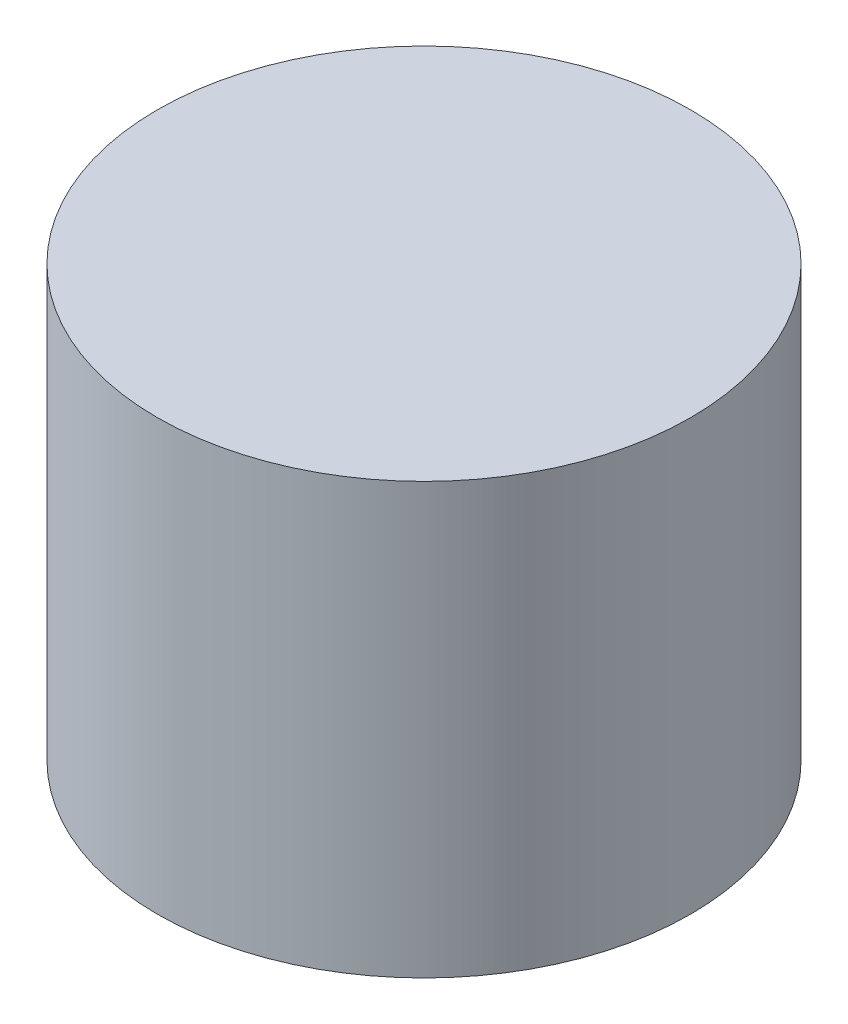
ISO-10303-21;
HEADER;
FILE_DESCRIPTION(('STEP AP214'),'2;1');
FILE_NAME('part.step','',(''),(''),'','','');
FILE_SCHEMA(('AUTOMOTIVE_DESIGN { 1 0 10303 214 1 1 1 1 }'));
ENDSEC;
DATA;
#1=APPLICATION_CONTEXT('core data for automotive mechanical design processes');
#2=APPLICATION_PROTOCOL_DEFINITION('international standard','automotive_design',2000,#1);
#3=PRODUCT_CONTEXT('',#1,'mechanical');
#4=PRODUCT('Part','Part','',(#3));
#5=PRODUCT_RELATED_PRODUCT_CATEGORY('part','',(#4));
#6=PRODUCT_DEFINITION_FORMATION('','',#4);
#7=PRODUCT_DEFINITION_CONTEXT('part definition',#1,'design');
#8=PRODUCT_DEFINITION('design','',#6,#7);
#9=PRODUCT_DEFINITION_SHAPE('','',#8);
#10=(LENGTH_UNIT() NAMED_UNIT(*) SI_UNIT(.MILLI.,.METRE.));
#11=(NAMED_UNIT(*) PLANE_ANGLE_UNIT() SI_UNIT($,.RADIAN.));
#12=(NAMED_UNIT(*) SI_UNIT($,.STERADIAN.) SOLID_ANGLE_UNIT());
#13=UNCERTAINTY_MEASURE_WITH_UNIT(LENGTH_MEASURE(1.E-05),#10,'distance_accuracy_value','');
#14=(GEOMETRIC_REPRESENTATION_CONTEXT(3) GLOBAL_UNCERTAINTY_ASSIGNED_CONTEXT((#13)) GLOBAL_UNIT_ASSIGNED_CONTEXT((#10,
#11,#12)) REPRESENTATION_CONTEXT('',''));
#15=CARTESIAN_POINT('',(0.,0.,0.));
#16=DIRECTION('',(0.,0.,1.));
#17=DIRECTION('',(1.,0.,0.));
#18=AXIS2_PLACEMENT_3D('',#15,#16,#17);
#19=CARTESIAN_POINT('',(0.,75.,0.));
#20=DIRECTION('',(0.,-1.,0.));
#21=DIRECTION('',(0.,0.,-1.));
#22=AXIS2_PLACEMENT_3D('',#19,#20,#21);
#23=CYLINDRICAL_SURFACE('',#22,46.5);
#24=CARTESIAN_POINT('',(0.,75.,0.));
#25=DIRECTION('',(0.,1.,0.));
#26=DIRECTION('',(0.,0.,1.));
#27=AXIS2_PLACEMENT_3D('',#24,#25,#26);
#28=CIRCLE('',#27,46.5);
#29=CARTESIAN_POINT('',(0.,75.,46.5));
#30=VERTEX_POINT('',#29);
#31=EDGE_CURVE('E10',#30,#30,#28,.T.);
#32=ORIENTED_EDGE('',*,*,#31,.F.);
#33=EDGE_LOOP('',(#32));
#34=FACE_BOUND('',#33,.T.);
#35=CARTESIAN_POINT('',(0.,0.,0.));
#36=DIRECTION('',(0.,1.,0.));
#37=DIRECTION('',(0.,0.,1.));
#38=AXIS2_PLACEMENT_3D('',#35,#36,#37);
#39=CIRCLE('',#38,46.5);
#40=CARTESIAN_POINT('',(0.,0.,46.5));
#41=VERTEX_POINT('',#40);
#42=EDGE_CURVE('E44',#41,#41,#39,.T.);
#43=ORIENTED_EDGE('',*,*,#42,.T.);
#44=EDGE_LOOP('',(#43));
#45=FACE_BOUND('',#44,.T.);
#46=ADVANCED_FACE('F41',(#34,#45),#23,.T.);
#47=CARTESIAN_POINT('',(0.,75.,0.));
#48=DIRECTION('',(0.,1.,0.));
#49=DIRECTION('',(0.,0.,1.));
#50=AXIS2_PLACEMENT_3D('',#47,#48,#49);
#51=PLANE('',#50);
#52=ORIENTED_EDGE('',*,*,#31,.T.);
#53=EDGE_LOOP('',(#52));
#54=FACE_BOUND('',#53,.T.);
#55=ADVANCED_FACE('F56',(#54),#51,.T.);
#56=CARTESIAN_POINT('',(0.,0.,0.));
#57=DIRECTION('',(0.,1.,0.));
#58=DIRECTION('',(0.,0.,1.));
#59=AXIS2_PLACEMENT_3D('',#56,#57,#58);
#60=PLANE('',#59);
#61=ORIENTED_EDGE('',*,*,#42,.F.);
#62=EDGE_LOOP('',(#61));
#63=FACE_BOUND('',#62,.T.);
#64=ADVANCED_FACE('F54',(#63),#60,.F.);
#65=CLOSED_SHELL('',(#46,#55,#64));
#66=MANIFOLD_SOLID_BREP('B2',#65);
#67=ADVANCED_BREP_SHAPE_REPRESENTATION('',(#18,#66),#14);
#68=SHAPE_DEFINITION_REPRESENTATION(#9,#67);
ENDSEC;
END-ISO-10303-21;
